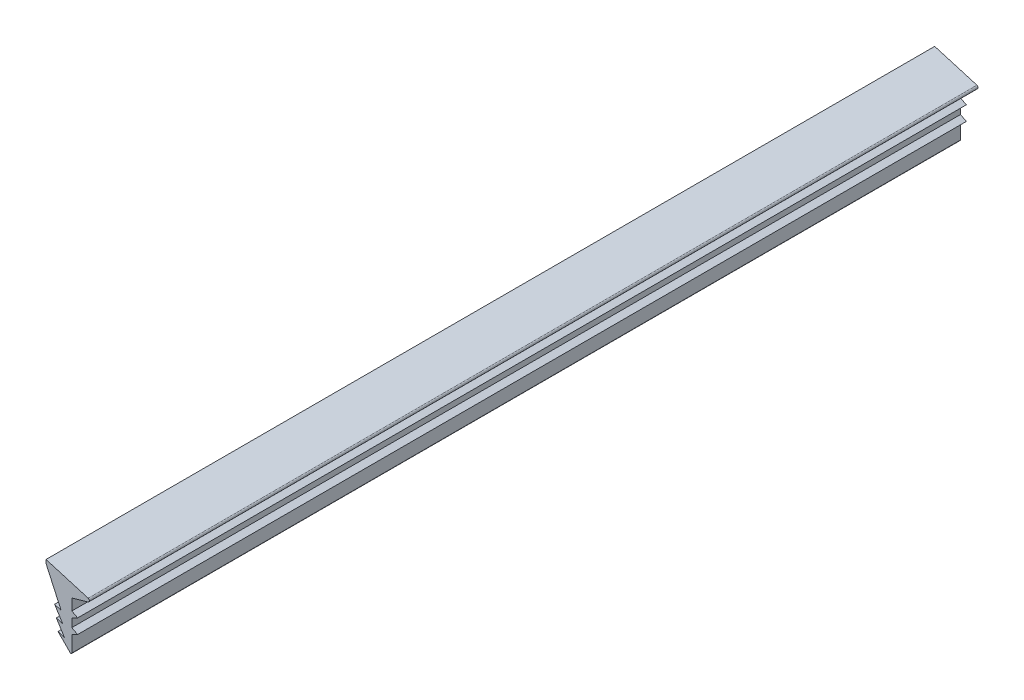
ISO-10303-21;
HEADER;
FILE_DESCRIPTION(('STEP AP214'),'2;1');
FILE_NAME('part.step','',(''),(''),'','','');
FILE_SCHEMA(('AUTOMOTIVE_DESIGN { 1 0 10303 214 1 1 1 1 }'));
ENDSEC;
DATA;
#1=APPLICATION_CONTEXT('core data for automotive mechanical design processes');
#2=APPLICATION_PROTOCOL_DEFINITION('international standard','automotive_design',2000,#1);
#3=PRODUCT_CONTEXT('',#1,'mechanical');
#4=PRODUCT('Part','Part','',(#3));
#5=PRODUCT_RELATED_PRODUCT_CATEGORY('part','',(#4));
#6=PRODUCT_DEFINITION_FORMATION('','',#4);
#7=PRODUCT_DEFINITION_CONTEXT('part definition',#1,'design');
#8=PRODUCT_DEFINITION('design','',#6,#7);
#9=PRODUCT_DEFINITION_SHAPE('','',#8);
#10=(LENGTH_UNIT() NAMED_UNIT(*) SI_UNIT(.MILLI.,.METRE.));
#11=(NAMED_UNIT(*) PLANE_ANGLE_UNIT() SI_UNIT($,.RADIAN.));
#12=(NAMED_UNIT(*) SI_UNIT($,.STERADIAN.) SOLID_ANGLE_UNIT());
#13=UNCERTAINTY_MEASURE_WITH_UNIT(LENGTH_MEASURE(1.E-05),#10,'distance_accuracy_value','');
#14=(GEOMETRIC_REPRESENTATION_CONTEXT(3) GLOBAL_UNCERTAINTY_ASSIGNED_CONTEXT((#13)) GLOBAL_UNIT_ASSIGNED_CONTEXT((#10,
#11,#12)) REPRESENTATION_CONTEXT('',''));
#15=CARTESIAN_POINT('',(0.,0.,0.));
#16=DIRECTION('',(0.,0.,1.));
#17=DIRECTION('',(1.,0.,0.));
#18=AXIS2_PLACEMENT_3D('',#15,#16,#17);
#19=CARTESIAN_POINT('',(1.83562174373094,6.17250966923791,100.));
#20=DIRECTION('',(0.,0.,-1.));
#21=DIRECTION('',(-1.,0.,0.));
#22=AXIS2_PLACEMENT_3D('',#19,#20,#21);
#23=CYLINDRICAL_SURFACE('',#22,0.199999999999988);
#24=CARTESIAN_POINT('',(1.83562174373094,6.17250966923791,0.));
#25=DIRECTION('',(0.,0.,1.));
#26=DIRECTION('',(1.,0.,0.));
#27=AXIS2_PLACEMENT_3D('',#24,#25,#26);
#28=CIRCLE('',#27,0.199999999999988);
#29=CARTESIAN_POINT('',(1.89024785978819,5.98011427572624,0.));
#30=VERTEX_POINT('',#29);
#31=CARTESIAN_POINT('',(1.91051139307632,6.35795923224873,0.));
#32=VERTEX_POINT('',#31);
#33=EDGE_CURVE('E197',#30,#32,#28,.T.);
#34=ORIENTED_EDGE('',*,*,#33,.T.);
#35=DIRECTION('',(0.,0.,-1.));
#36=VECTOR('',#35,1.);
#37=CARTESIAN_POINT('',(1.91051139307632,6.35795923224873,100.));
#38=LINE('',#37,#36);
#39=CARTESIAN_POINT('',(1.91051139307632,6.35795923224873,100.));
#40=VERTEX_POINT('',#39);
#41=EDGE_CURVE('E11',#40,#32,#38,.T.);
#42=ORIENTED_EDGE('',*,*,#41,.F.);
#43=CARTESIAN_POINT('',(1.83562174373094,6.17250966923791,100.));
#44=DIRECTION('',(0.,0.,1.));
#45=DIRECTION('',(1.,0.,0.));
#46=AXIS2_PLACEMENT_3D('',#43,#44,#45);
#47=CIRCLE('',#46,0.199999999999988);
#48=CARTESIAN_POINT('',(1.89024785978819,5.98011427572624,100.));
#49=VERTEX_POINT('',#48);
#50=EDGE_CURVE('E233',#49,#40,#47,.T.);
#51=ORIENTED_EDGE('',*,*,#50,.F.);
#52=DIRECTION('',(0.,0.,-1.));
#53=VECTOR('',#52,1.);
#54=CARTESIAN_POINT('',(1.89024785978819,5.98011427572624,100.));
#55=LINE('',#54,#53);
#56=EDGE_CURVE('E193',#49,#30,#55,.T.);
#57=ORIENTED_EDGE('',*,*,#56,.T.);
#58=EDGE_LOOP('',(#34,#42,#51,#57));
#59=FACE_BOUND('',#58,.T.);
#60=ADVANCED_FACE('F35',(#59),#23,.T.);
#61=CARTESIAN_POINT('',(1.91051139307632,6.35795923224873,100.));
#62=DIRECTION('',(-0.282629364260122,-0.959229191829523,0.));
#63=DIRECTION('',(0.959229191829523,-0.282629364260122,0.));
#64=AXIS2_PLACEMENT_3D('',#61,#62,#63);
#65=PLANE('',#64);
#66=DIRECTION('',(-0.959229191829523,0.282629364260122,0.));
#67=VECTOR('',#66,1.);
#68=CARTESIAN_POINT('',(1.91051139307632,6.35795923224873,0.));
#69=LINE('',#68,#67);
#70=CARTESIAN_POINT('',(-2.83817796549829,7.75712333808974,0.));
#71=VERTEX_POINT('',#70);
#72=EDGE_CURVE('E200',#32,#71,#69,.T.);
#73=ORIENTED_EDGE('',*,*,#72,.T.);
#74=DIRECTION('',(0.,0.,-1.));
#75=VECTOR('',#74,1.);
#76=CARTESIAN_POINT('',(-2.83817796549829,7.75712333808974,100.));
#77=LINE('',#76,#75);
#78=CARTESIAN_POINT('',(-2.83817796549829,7.75712333808974,100.));
#79=VERTEX_POINT('',#78);
#80=EDGE_CURVE('E43',#79,#71,#77,.T.);
#81=ORIENTED_EDGE('',*,*,#80,.F.);
#82=DIRECTION('',(-0.959229191829523,0.282629364260122,0.));
#83=VECTOR('',#82,1.);
#84=CARTESIAN_POINT('',(1.91051139307632,6.35795923224873,100.));
#85=LINE('',#84,#83);
#86=EDGE_CURVE('E127',#40,#79,#85,.T.);
#87=ORIENTED_EDGE('',*,*,#86,.F.);
#88=ORIENTED_EDGE('',*,*,#41,.T.);
#89=EDGE_LOOP('',(#73,#81,#87,#88));
#90=FACE_BOUND('',#89,.T.);
#91=ADVANCED_FACE('F346',(#90),#65,.F.);
#92=CARTESIAN_POINT('',(-2.83817796549829,7.37355976867627,100.));
#93=DIRECTION('',(1.,0.,0.));
#94=DIRECTION('',(0.,0.,-1.));
#95=AXIS2_PLACEMENT_3D('',#92,#93,#94);
#96=PLANE('',#95);
#97=DIRECTION('',(0.,-1.,0.));
#98=VECTOR('',#97,1.);
#99=CARTESIAN_POINT('',(-2.83817796549829,7.37355976867627,0.));
#100=LINE('',#99,#98);
#101=CARTESIAN_POINT('',(-2.83817796549829,7.37355976867627,0.));
#102=VERTEX_POINT('',#101);
#103=EDGE_CURVE('E202',#71,#102,#100,.T.);
#104=ORIENTED_EDGE('',*,*,#103,.T.);
#105=DIRECTION('',(0.,0.,-1.));
#106=VECTOR('',#105,1.);
#107=CARTESIAN_POINT('',(-2.83817796549829,7.37355976867627,100.));
#108=LINE('',#107,#106);
#109=CARTESIAN_POINT('',(-2.83817796549829,7.37355976867627,100.));
#110=VERTEX_POINT('',#109);
#111=EDGE_CURVE('E273',#110,#102,#108,.T.);
#112=ORIENTED_EDGE('',*,*,#111,.F.);
#113=DIRECTION('',(0.,-1.,0.));
#114=VECTOR('',#113,1.);
#115=CARTESIAN_POINT('',(-2.83817796549829,7.37355976867627,100.));
#116=LINE('',#115,#114);
#117=EDGE_CURVE('E281',#79,#110,#116,.T.);
#118=ORIENTED_EDGE('',*,*,#117,.F.);
#119=ORIENTED_EDGE('',*,*,#80,.T.);
#120=EDGE_LOOP('',(#104,#112,#118,#119));
#121=FACE_BOUND('',#120,.T.);
#122=ADVANCED_FACE('F279',(#121),#96,.F.);
#123=CARTESIAN_POINT('',(-1.13165430904246,3.6309799731963,100.));
#124=DIRECTION('',(0.909875769600127,0.414880806852494,0.));
#125=DIRECTION('',(-0.414880806852494,0.909875769600127,0.));
#126=AXIS2_PLACEMENT_3D('',#123,#124,#125);
#127=PLANE('',#126);
#128=DIRECTION('',(0.414880806852494,-0.909875769600127,0.));
#129=VECTOR('',#128,1.);
#130=CARTESIAN_POINT('',(-1.13165430904246,3.6309799731963,0.));
#131=LINE('',#130,#129);
#132=CARTESIAN_POINT('',(-1.13165430904246,3.6309799731963,0.));
#133=VERTEX_POINT('',#132);
#134=EDGE_CURVE('E204',#102,#133,#131,.T.);
#135=ORIENTED_EDGE('',*,*,#134,.T.);
#136=DIRECTION('',(0.,0.,-1.));
#137=VECTOR('',#136,1.);
#138=CARTESIAN_POINT('',(-1.13165430904246,3.6309799731963,100.));
#139=LINE('',#138,#137);
#140=CARTESIAN_POINT('',(-1.13165430904246,3.6309799731963,100.));
#141=VERTEX_POINT('',#140);
#142=EDGE_CURVE('E270',#141,#133,#139,.T.);
#143=ORIENTED_EDGE('',*,*,#142,.F.);
#144=DIRECTION('',(0.414880806852494,-0.909875769600127,0.));
#145=VECTOR('',#144,1.);
#146=CARTESIAN_POINT('',(-1.13165430904246,3.6309799731963,100.));
#147=LINE('',#146,#145);
#148=EDGE_CURVE('E299',#110,#141,#147,.T.);
#149=ORIENTED_EDGE('',*,*,#148,.F.);
#150=ORIENTED_EDGE('',*,*,#111,.T.);
#151=EDGE_LOOP('',(#135,#143,#149,#150));
#152=FACE_BOUND('',#151,.T.);
#153=ADVANCED_FACE('F290',(#152),#127,.F.);
#154=CARTESIAN_POINT('',(-1.86635680574454,3.88109048555646,100.));
#155=DIRECTION('',(-0.32226267098872,-0.94665028964619,0.));
#156=DIRECTION('',(0.94665028964619,-0.32226267098872,0.));
#157=AXIS2_PLACEMENT_3D('',#154,#155,#156);
#158=PLANE('',#157);
#159=DIRECTION('',(-0.94665028964619,0.32226267098872,0.));
#160=VECTOR('',#159,1.);
#161=CARTESIAN_POINT('',(-1.86635680574454,3.88109048555646,0.));
#162=LINE('',#161,#160);
#163=CARTESIAN_POINT('',(-1.86635680574454,3.88109048555646,0.));
#164=VERTEX_POINT('',#163);
#165=EDGE_CURVE('E206',#133,#164,#162,.T.);
#166=ORIENTED_EDGE('',*,*,#165,.T.);
#167=DIRECTION('',(0.,0.,-1.));
#168=VECTOR('',#167,1.);
#169=CARTESIAN_POINT('',(-1.86635680574454,3.88109048555646,100.));
#170=LINE('',#169,#168);
#171=CARTESIAN_POINT('',(-1.86635680574454,3.88109048555646,100.));
#172=VERTEX_POINT('',#171);
#173=EDGE_CURVE('E267',#172,#164,#170,.T.);
#174=ORIENTED_EDGE('',*,*,#173,.F.);
#175=DIRECTION('',(-0.94665028964619,0.32226267098872,0.));
#176=VECTOR('',#175,1.);
#177=CARTESIAN_POINT('',(-1.86635680574454,3.88109048555646,100.));
#178=LINE('',#177,#176);
#179=EDGE_CURVE('E296',#141,#172,#178,.T.);
#180=ORIENTED_EDGE('',*,*,#179,.F.);
#181=ORIENTED_EDGE('',*,*,#142,.T.);
#182=EDGE_LOOP('',(#166,#174,#180,#181));
#183=FACE_BOUND('',#182,.T.);
#184=ADVANCED_FACE('F294',(#183),#158,.F.);
#185=CARTESIAN_POINT('',(-0.940400183170823,2.39667458437282,100.));
#186=DIRECTION('',(0.848461232974316,0.529257532907849,0.));
#187=DIRECTION('',(-0.529257532907849,0.848461232974317,0.));
#188=AXIS2_PLACEMENT_3D('',#185,#186,#187);
#189=PLANE('',#188);
#190=DIRECTION('',(0.529257532907849,-0.848461232974316,0.));
#191=VECTOR('',#190,1.);
#192=CARTESIAN_POINT('',(-0.940400183170823,2.39667458437282,0.));
#193=LINE('',#192,#191);
#194=CARTESIAN_POINT('',(-0.940400183170823,2.39667458437282,0.));
#195=VERTEX_POINT('',#194);
#196=EDGE_CURVE('E208',#164,#195,#193,.T.);
#197=ORIENTED_EDGE('',*,*,#196,.T.);
#198=DIRECTION('',(0.,0.,-1.));
#199=VECTOR('',#198,1.);
#200=CARTESIAN_POINT('',(-0.940400183170823,2.39667458437282,100.));
#201=LINE('',#200,#199);
#202=CARTESIAN_POINT('',(-0.940400183170823,2.39667458437282,100.));
#203=VERTEX_POINT('',#202);
#204=EDGE_CURVE('E264',#203,#195,#201,.T.);
#205=ORIENTED_EDGE('',*,*,#204,.F.);
#206=DIRECTION('',(0.529257532907849,-0.848461232974316,0.));
#207=VECTOR('',#206,1.);
#208=CARTESIAN_POINT('',(-0.940400183170823,2.39667458437282,100.));
#209=LINE('',#208,#207);
#210=EDGE_CURVE('E298',#172,#203,#209,.T.);
#211=ORIENTED_EDGE('',*,*,#210,.F.);
#212=ORIENTED_EDGE('',*,*,#173,.T.);
#213=EDGE_LOOP('',(#197,#205,#211,#212));
#214=FACE_BOUND('',#213,.T.);
#215=ADVANCED_FACE('F359',(#214),#189,.F.);
#216=CARTESIAN_POINT('',(-1.67510267987291,2.64678509673297,100.));
#217=DIRECTION('',(-0.32226267098872,-0.94665028964619,0.));
#218=DIRECTION('',(0.94665028964619,-0.32226267098872,0.));
#219=AXIS2_PLACEMENT_3D('',#216,#217,#218);
#220=PLANE('',#219);
#221=DIRECTION('',(-0.94665028964619,0.32226267098872,0.));
#222=VECTOR('',#221,1.);
#223=CARTESIAN_POINT('',(-1.67510267987291,2.64678509673297,0.));
#224=LINE('',#223,#222);
#225=CARTESIAN_POINT('',(-1.67510267987291,2.64678509673297,0.));
#226=VERTEX_POINT('',#225);
#227=EDGE_CURVE('E210',#195,#226,#224,.T.);
#228=ORIENTED_EDGE('',*,*,#227,.T.);
#229=DIRECTION('',(0.,0.,-1.));
#230=VECTOR('',#229,1.);
#231=CARTESIAN_POINT('',(-1.67510267987291,2.64678509673297,100.));
#232=LINE('',#231,#230);
#233=CARTESIAN_POINT('',(-1.67510267987291,2.64678509673297,100.));
#234=VERTEX_POINT('',#233);
#235=EDGE_CURVE('E261',#234,#226,#232,.T.);
#236=ORIENTED_EDGE('',*,*,#235,.F.);
#237=DIRECTION('',(-0.94665028964619,0.32226267098872,0.));
#238=VECTOR('',#237,1.);
#239=CARTESIAN_POINT('',(-1.67510267987291,2.64678509673297,100.));
#240=LINE('',#239,#238);
#241=EDGE_CURVE('E301',#203,#234,#240,.T.);
#242=ORIENTED_EDGE('',*,*,#241,.F.);
#243=ORIENTED_EDGE('',*,*,#204,.T.);
#244=EDGE_LOOP('',(#228,#236,#242,#243));
#245=FACE_BOUND('',#244,.T.);
#246=ADVANCED_FACE('F362',(#245),#220,.F.);
#247=CARTESIAN_POINT('',(-0.749146057299185,1.16236919554933,100.));
#248=DIRECTION('',(0.848461232974316,0.529257532907849,0.));
#249=DIRECTION('',(-0.529257532907849,0.848461232974317,0.));
#250=AXIS2_PLACEMENT_3D('',#247,#248,#249);
#251=PLANE('',#250);
#252=DIRECTION('',(0.529257532907849,-0.848461232974316,0.));
#253=VECTOR('',#252,1.);
#254=CARTESIAN_POINT('',(-0.749146057299185,1.16236919554933,0.));
#255=LINE('',#254,#253);
#256=CARTESIAN_POINT('',(-0.749146057299185,1.16236919554933,0.));
#257=VERTEX_POINT('',#256);
#258=EDGE_CURVE('E212',#226,#257,#255,.T.);
#259=ORIENTED_EDGE('',*,*,#258,.T.);
#260=DIRECTION('',(0.,0.,-1.));
#261=VECTOR('',#260,1.);
#262=CARTESIAN_POINT('',(-0.749146057299185,1.16236919554933,100.));
#263=LINE('',#262,#261);
#264=CARTESIAN_POINT('',(-0.749146057299185,1.16236919554933,100.));
#265=VERTEX_POINT('',#264);
#266=EDGE_CURVE('E258',#265,#257,#263,.T.);
#267=ORIENTED_EDGE('',*,*,#266,.F.);
#268=DIRECTION('',(0.529257532907849,-0.848461232974316,0.));
#269=VECTOR('',#268,1.);
#270=CARTESIAN_POINT('',(-0.749146057299185,1.16236919554933,100.));
#271=LINE('',#270,#269);
#272=EDGE_CURVE('E307',#234,#265,#271,.T.);
#273=ORIENTED_EDGE('',*,*,#272,.F.);
#274=ORIENTED_EDGE('',*,*,#235,.T.);
#275=EDGE_LOOP('',(#259,#267,#273,#274));
#276=FACE_BOUND('',#275,.T.);
#277=ADVANCED_FACE('F366',(#276),#251,.F.);
#278=CARTESIAN_POINT('',(-1.48384855400127,1.41247970790948,100.));
#279=DIRECTION('',(-0.32226267098872,-0.94665028964619,0.));
#280=DIRECTION('',(0.94665028964619,-0.32226267098872,0.));
#281=AXIS2_PLACEMENT_3D('',#278,#279,#280);
#282=PLANE('',#281);
#283=DIRECTION('',(-0.94665028964619,0.32226267098872,0.));
#284=VECTOR('',#283,1.);
#285=CARTESIAN_POINT('',(-1.48384855400127,1.41247970790948,0.));
#286=LINE('',#285,#284);
#287=CARTESIAN_POINT('',(-1.48384855400127,1.41247970790948,0.));
#288=VERTEX_POINT('',#287);
#289=EDGE_CURVE('E214',#257,#288,#286,.T.);
#290=ORIENTED_EDGE('',*,*,#289,.T.);
#291=DIRECTION('',(0.,0.,-1.));
#292=VECTOR('',#291,1.);
#293=CARTESIAN_POINT('',(-1.48384855400127,1.41247970790948,100.));
#294=LINE('',#293,#292);
#295=CARTESIAN_POINT('',(-1.48384855400127,1.41247970790948,100.));
#296=VERTEX_POINT('',#295);
#297=EDGE_CURVE('E255',#296,#288,#294,.T.);
#298=ORIENTED_EDGE('',*,*,#297,.F.);
#299=DIRECTION('',(-0.94665028964619,0.32226267098872,0.));
#300=VECTOR('',#299,1.);
#301=CARTESIAN_POINT('',(-1.48384855400127,1.41247970790948,100.));
#302=LINE('',#301,#300);
#303=EDGE_CURVE('E309',#265,#296,#302,.T.);
#304=ORIENTED_EDGE('',*,*,#303,.F.);
#305=ORIENTED_EDGE('',*,*,#266,.T.);
#306=EDGE_LOOP('',(#290,#298,#304,#305));
#307=FACE_BOUND('',#306,.T.);
#308=ADVANCED_FACE('F370',(#307),#282,.F.);
#309=CARTESIAN_POINT('',(-0.109115740648349,0.022183720300518,100.));
#310=DIRECTION('',(0.711075521663788,0.703115639486544,0.));
#311=DIRECTION('',(-0.703115639486545,0.711075521663788,0.));
#312=AXIS2_PLACEMENT_3D('',#309,#310,#311);
#313=PLANE('',#312);
#314=DIRECTION('',(0.703115639486544,-0.711075521663788,0.));
#315=VECTOR('',#314,1.);
#316=CARTESIAN_POINT('',(-0.109115740648349,0.022183720300518,0.));
#317=LINE('',#316,#315);
#318=CARTESIAN_POINT('',(-0.109115740648349,0.022183720300518,0.));
#319=VERTEX_POINT('',#318);
#320=EDGE_CURVE('E216',#288,#319,#317,.T.);
#321=ORIENTED_EDGE('',*,*,#320,.T.);
#322=DIRECTION('',(0.,0.,-1.));
#323=VECTOR('',#322,1.);
#324=CARTESIAN_POINT('',(-0.109115740648349,0.022183720300518,100.));
#325=LINE('',#324,#323);
#326=CARTESIAN_POINT('',(-0.109115740648349,0.022183720300518,100.));
#327=VERTEX_POINT('',#326);
#328=EDGE_CURVE('E252',#327,#319,#325,.T.);
#329=ORIENTED_EDGE('',*,*,#328,.F.);
#330=DIRECTION('',(0.703115639486544,-0.711075521663788,0.));
#331=VECTOR('',#330,1.);
#332=CARTESIAN_POINT('',(-0.109115740648349,0.022183720300518,100.));
#333=LINE('',#332,#331);
#334=EDGE_CURVE('E311',#296,#327,#333,.T.);
#335=ORIENTED_EDGE('',*,*,#334,.F.);
#336=ORIENTED_EDGE('',*,*,#297,.T.);
#337=EDGE_LOOP('',(#321,#329,#335,#336));
#338=FACE_BOUND('',#337,.T.);
#339=ADVANCED_FACE('F374',(#338),#313,.F.);
#340=CARTESIAN_POINT('',(-0.0380081884819674,0.0924952842491393,100.));
#341=DIRECTION('',(0.,0.,-1.));
#342=DIRECTION('',(-1.,0.,0.));
#343=AXIS2_PLACEMENT_3D('',#340,#341,#342);
#344=CYLINDRICAL_SURFACE('',#343,0.100000000000001);
#345=CARTESIAN_POINT('',(-0.0380081884819674,0.0924952842491393,0.));
#346=DIRECTION('',(0.,0.,1.));
#347=DIRECTION('',(1.,0.,0.));
#348=AXIS2_PLACEMENT_3D('',#345,#346,#347);
#349=CIRCLE('',#348,0.100000000000001);
#350=CARTESIAN_POINT('',(0.0619918115180333,0.0924952842491393,0.));
#351=VERTEX_POINT('',#350);
#352=EDGE_CURVE('E218',#319,#351,#349,.T.);
#353=ORIENTED_EDGE('',*,*,#352,.T.);
#354=DIRECTION('',(0.,0.,-1.));
#355=VECTOR('',#354,1.);
#356=CARTESIAN_POINT('',(0.0619918115180333,0.0924952842491393,100.));
#357=LINE('',#356,#355);
#358=CARTESIAN_POINT('',(0.0619918115180333,0.0924952842491393,100.));
#359=VERTEX_POINT('',#358);
#360=EDGE_CURVE('E249',#359,#351,#357,.T.);
#361=ORIENTED_EDGE('',*,*,#360,.F.);
#362=CARTESIAN_POINT('',(-0.0380081884819674,0.0924952842491393,100.));
#363=DIRECTION('',(0.,0.,1.));
#364=DIRECTION('',(1.,0.,0.));
#365=AXIS2_PLACEMENT_3D('',#362,#363,#364);
#366=CIRCLE('',#365,0.100000000000001);
#367=EDGE_CURVE('E313',#327,#359,#366,.T.);
#368=ORIENTED_EDGE('',*,*,#367,.F.);
#369=ORIENTED_EDGE('',*,*,#328,.T.);
#370=EDGE_LOOP('',(#353,#361,#368,#369));
#371=FACE_BOUND('',#370,.T.);
#372=ADVANCED_FACE('F378',(#371),#344,.T.);
#373=CARTESIAN_POINT('',(0.0619918115180553,1.89317829195909,100.));
#374=DIRECTION('',(-1.,0.,0.));
#375=DIRECTION('',(0.,0.,1.));
#376=AXIS2_PLACEMENT_3D('',#373,#374,#375);
#377=PLANE('',#376);
#378=DIRECTION('',(0.,1.,0.));
#379=VECTOR('',#378,1.);
#380=CARTESIAN_POINT('',(0.0619918115180553,1.89317829195909,0.));
#381=LINE('',#380,#379);
#382=CARTESIAN_POINT('',(0.0619918115180553,1.89317829195909,0.));
#383=VERTEX_POINT('',#382);
#384=EDGE_CURVE('E220',#351,#383,#381,.T.);
#385=ORIENTED_EDGE('',*,*,#384,.T.);
#386=DIRECTION('',(0.,0.,-1.));
#387=VECTOR('',#386,1.);
#388=CARTESIAN_POINT('',(0.0619918115180553,1.89317829195909,100.));
#389=LINE('',#388,#387);
#390=CARTESIAN_POINT('',(0.0619918115180553,1.89317829195909,100.));
#391=VERTEX_POINT('',#390);
#392=EDGE_CURVE('E246',#391,#383,#389,.T.);
#393=ORIENTED_EDGE('',*,*,#392,.F.);
#394=DIRECTION('',(0.,1.,0.));
#395=VECTOR('',#394,1.);
#396=CARTESIAN_POINT('',(0.0619918115180553,1.89317829195909,100.));
#397=LINE('',#396,#395);
#398=EDGE_CURVE('E315',#359,#391,#397,.T.);
#399=ORIENTED_EDGE('',*,*,#398,.F.);
#400=ORIENTED_EDGE('',*,*,#360,.T.);
#401=EDGE_LOOP('',(#385,#393,#399,#400));
#402=FACE_BOUND('',#401,.T.);
#403=ADVANCED_FACE('F382',(#402),#377,.F.);
#404=CARTESIAN_POINT('',(0.0619918115180553,1.89317829195909,100.));
#405=DIRECTION('',(-0.449868640180448,0.893094735502452,0.));
#406=DIRECTION('',(-0.893094735502452,-0.449868640180448,0.));
#407=AXIS2_PLACEMENT_3D('',#404,#405,#406);
#408=PLANE('',#407);
#409=DIRECTION('',(0.893094735502452,0.449868640180448,0.));
#410=VECTOR('',#409,1.);
#411=CARTESIAN_POINT('',(0.0619918115180553,1.89317829195909,0.));
#412=LINE('',#411,#410);
#413=CARTESIAN_POINT('',(0.725818022890962,2.22756005814256,0.));
#414=VERTEX_POINT('',#413);
#415=EDGE_CURVE('E222',#383,#414,#412,.T.);
#416=ORIENTED_EDGE('',*,*,#415,.T.);
#417=DIRECTION('',(0.,0.,-1.));
#418=VECTOR('',#417,1.);
#419=CARTESIAN_POINT('',(0.725818022890962,2.22756005814256,100.));
#420=LINE('',#419,#418);
#421=CARTESIAN_POINT('',(0.725818022890962,2.22756005814256,100.));
#422=VERTEX_POINT('',#421);
#423=EDGE_CURVE('E243',#422,#414,#420,.T.);
#424=ORIENTED_EDGE('',*,*,#423,.F.);
#425=DIRECTION('',(0.893094735502452,0.449868640180448,0.));
#426=VECTOR('',#425,1.);
#427=CARTESIAN_POINT('',(0.0619918115180553,1.89317829195909,100.));
#428=LINE('',#427,#426);
#429=EDGE_CURVE('E317',#391,#422,#428,.T.);
#430=ORIENTED_EDGE('',*,*,#429,.F.);
#431=ORIENTED_EDGE('',*,*,#392,.T.);
#432=EDGE_LOOP('',(#416,#424,#430,#431));
#433=FACE_BOUND('',#432,.T.);
#434=ADVANCED_FACE('F386',(#433),#408,.F.);
#435=CARTESIAN_POINT('',(0.0619918115180553,2.56194182432603,100.));
#436=DIRECTION('',(-0.449868640180448,-0.893094735502452,0.));
#437=DIRECTION('',(0.893094735502452,-0.449868640180448,0.));
#438=AXIS2_PLACEMENT_3D('',#435,#436,#437);
#439=PLANE('',#438);
#440=DIRECTION('',(-0.893094735502452,0.449868640180448,0.));
#441=VECTOR('',#440,1.);
#442=CARTESIAN_POINT('',(0.0619918115180553,2.56194182432603,0.));
#443=LINE('',#442,#441);
#444=CARTESIAN_POINT('',(0.0619918115180553,2.56194182432603,0.));
#445=VERTEX_POINT('',#444);
#446=EDGE_CURVE('E224',#414,#445,#443,.T.);
#447=ORIENTED_EDGE('',*,*,#446,.T.);
#448=DIRECTION('',(0.,0.,-1.));
#449=VECTOR('',#448,1.);
#450=CARTESIAN_POINT('',(0.0619918115180553,2.56194182432603,100.));
#451=LINE('',#450,#449);
#452=CARTESIAN_POINT('',(0.0619918115180553,2.56194182432603,100.));
#453=VERTEX_POINT('',#452);
#454=EDGE_CURVE('E240',#453,#445,#451,.T.);
#455=ORIENTED_EDGE('',*,*,#454,.F.);
#456=DIRECTION('',(-0.893094735502452,0.449868640180448,0.));
#457=VECTOR('',#456,1.);
#458=CARTESIAN_POINT('',(0.0619918115180553,2.56194182432603,100.));
#459=LINE('',#458,#457);
#460=EDGE_CURVE('E319',#422,#453,#459,.T.);
#461=ORIENTED_EDGE('',*,*,#460,.F.);
#462=ORIENTED_EDGE('',*,*,#423,.T.);
#463=EDGE_LOOP('',(#447,#455,#461,#462));
#464=FACE_BOUND('',#463,.T.);
#465=ADVANCED_FACE('F390',(#464),#439,.F.);
#466=CARTESIAN_POINT('',(0.0619918115180553,2.56194182432603,100.));
#467=DIRECTION('',(-1.,0.,0.));
#468=DIRECTION('',(0.,0.,1.));
#469=AXIS2_PLACEMENT_3D('',#466,#467,#468);
#470=PLANE('',#469);
#471=DIRECTION('',(0.,1.,0.));
#472=VECTOR('',#471,1.);
#473=CARTESIAN_POINT('',(0.0619918115180553,2.56194182432603,0.));
#474=LINE('',#473,#472);
#475=CARTESIAN_POINT('',(0.0619918115180553,3.51260441788884,0.));
#476=VERTEX_POINT('',#475);
#477=EDGE_CURVE('E226',#445,#476,#474,.T.);
#478=ORIENTED_EDGE('',*,*,#477,.T.);
#479=DIRECTION('',(0.,0.,-1.));
#480=VECTOR('',#479,1.);
#481=CARTESIAN_POINT('',(0.0619918115180553,3.51260441788884,100.));
#482=LINE('',#481,#480);
#483=CARTESIAN_POINT('',(0.0619918115180553,3.51260441788884,100.));
#484=VERTEX_POINT('',#483);
#485=EDGE_CURVE('E237',#484,#476,#482,.T.);
#486=ORIENTED_EDGE('',*,*,#485,.F.);
#487=DIRECTION('',(0.,1.,0.));
#488=VECTOR('',#487,1.);
#489=CARTESIAN_POINT('',(0.0619918115180553,2.56194182432603,100.));
#490=LINE('',#489,#488);
#491=EDGE_CURVE('E321',#453,#484,#490,.T.);
#492=ORIENTED_EDGE('',*,*,#491,.F.);
#493=ORIENTED_EDGE('',*,*,#454,.T.);
#494=EDGE_LOOP('',(#478,#486,#492,#493));
#495=FACE_BOUND('',#494,.T.);
#496=ADVANCED_FACE('F327',(#495),#470,.F.);
#497=CARTESIAN_POINT('',(0.0619918115180553,3.51260441788884,100.));
#498=DIRECTION('',(-0.449868640180448,0.893094735502452,0.));
#499=DIRECTION('',(-0.893094735502452,-0.449868640180448,0.));
#500=AXIS2_PLACEMENT_3D('',#497,#498,#499);
#501=PLANE('',#500);
#502=DIRECTION('',(0.893094735502452,0.449868640180448,0.));
#503=VECTOR('',#502,1.);
#504=CARTESIAN_POINT('',(0.0619918115180553,3.51260441788884,0.));
#505=LINE('',#504,#503);
#506=CARTESIAN_POINT('',(0.725818022890962,3.84698618407231,0.));
#507=VERTEX_POINT('',#506);
#508=EDGE_CURVE('E228',#476,#507,#505,.T.);
#509=ORIENTED_EDGE('',*,*,#508,.T.);
#510=DIRECTION('',(0.,0.,-1.));
#511=VECTOR('',#510,1.);
#512=CARTESIAN_POINT('',(0.725818022890962,3.84698618407231,100.));
#513=LINE('',#512,#511);
#514=CARTESIAN_POINT('',(0.725818022890962,3.84698618407231,100.));
#515=VERTEX_POINT('',#514);
#516=EDGE_CURVE('E188',#515,#507,#513,.T.);
#517=ORIENTED_EDGE('',*,*,#516,.F.);
#518=DIRECTION('',(0.893094735502452,0.449868640180448,0.));
#519=VECTOR('',#518,1.);
#520=CARTESIAN_POINT('',(0.0619918115180553,3.51260441788884,100.));
#521=LINE('',#520,#519);
#522=EDGE_CURVE('E179',#484,#515,#521,.T.);
#523=ORIENTED_EDGE('',*,*,#522,.F.);
#524=ORIENTED_EDGE('',*,*,#485,.T.);
#525=EDGE_LOOP('',(#509,#517,#523,#524));
#526=FACE_BOUND('',#525,.T.);
#527=ADVANCED_FACE('F331',(#526),#501,.F.);
#528=CARTESIAN_POINT('',(0.0619918115180553,4.18136795025578,100.));
#529=DIRECTION('',(-0.449868640180448,-0.893094735502452,0.));
#530=DIRECTION('',(0.893094735502452,-0.449868640180448,0.));
#531=AXIS2_PLACEMENT_3D('',#528,#529,#530);
#532=PLANE('',#531);
#533=DIRECTION('',(-0.893094735502452,0.449868640180448,0.));
#534=VECTOR('',#533,1.);
#535=CARTESIAN_POINT('',(0.0619918115180553,4.18136795025578,0.));
#536=LINE('',#535,#534);
#537=CARTESIAN_POINT('',(0.0619918115180553,4.18136795025578,0.));
#538=VERTEX_POINT('',#537);
#539=EDGE_CURVE('E187',#507,#538,#536,.T.);
#540=ORIENTED_EDGE('',*,*,#539,.T.);
#541=DIRECTION('',(0.,0.,-1.));
#542=VECTOR('',#541,1.);
#543=CARTESIAN_POINT('',(0.0619918115180553,4.18136795025578,100.));
#544=LINE('',#543,#542);
#545=CARTESIAN_POINT('',(0.0619918115180553,4.18136795025578,100.));
#546=VERTEX_POINT('',#545);
#547=EDGE_CURVE('E184',#546,#538,#544,.T.);
#548=ORIENTED_EDGE('',*,*,#547,.F.);
#549=DIRECTION('',(-0.893094735502452,0.449868640180448,0.));
#550=VECTOR('',#549,1.);
#551=CARTESIAN_POINT('',(0.0619918115180553,4.18136795025578,100.));
#552=LINE('',#551,#550);
#553=EDGE_CURVE('E173',#515,#546,#552,.T.);
#554=ORIENTED_EDGE('',*,*,#553,.F.);
#555=ORIENTED_EDGE('',*,*,#516,.T.);
#556=EDGE_LOOP('',(#540,#548,#554,#555));
#557=FACE_BOUND('',#556,.T.);
#558=ADVANCED_FACE('F185',(#557),#532,.F.);
#559=CARTESIAN_POINT('',(0.0619918115180553,4.18136795025578,100.));
#560=DIRECTION('',(-1.,0.,0.));
#561=DIRECTION('',(0.,0.,1.));
#562=AXIS2_PLACEMENT_3D('',#559,#560,#561);
#563=PLANE('',#562);
#564=DIRECTION('',(0.,1.,0.));
#565=VECTOR('',#564,1.);
#566=CARTESIAN_POINT('',(0.0619918115180553,4.18136795025578,0.));
#567=LINE('',#566,#565);
#568=CARTESIAN_POINT('',(0.0619918115180553,5.46102426399386,0.));
#569=VERTEX_POINT('',#568);
#570=EDGE_CURVE('E113',#538,#569,#567,.T.);
#571=ORIENTED_EDGE('',*,*,#570,.T.);
#572=DIRECTION('',(0.,0.,-1.));
#573=VECTOR('',#572,1.);
#574=CARTESIAN_POINT('',(0.0619918115180553,5.46102426399386,100.));
#575=LINE('',#574,#573);
#576=CARTESIAN_POINT('',(0.0619918115180553,5.46102426399386,100.));
#577=VERTEX_POINT('',#576);
#578=EDGE_CURVE('E189',#577,#569,#575,.T.);
#579=ORIENTED_EDGE('',*,*,#578,.F.);
#580=DIRECTION('',(0.,1.,0.));
#581=VECTOR('',#580,1.);
#582=CARTESIAN_POINT('',(0.0619918115180553,4.18136795025578,100.));
#583=LINE('',#582,#581);
#584=EDGE_CURVE('E177',#546,#577,#583,.T.);
#585=ORIENTED_EDGE('',*,*,#584,.F.);
#586=ORIENTED_EDGE('',*,*,#547,.T.);
#587=EDGE_LOOP('',(#571,#579,#585,#586));
#588=FACE_BOUND('',#587,.T.);
#589=ADVANCED_FACE('F191',(#588),#563,.F.);
#590=CARTESIAN_POINT('',(0.0619918115180553,5.46102426399386,100.));
#591=DIRECTION('',(-0.27313058028635,0.961976967558185,0.));
#592=DIRECTION('',(-0.961976967558185,-0.27313058028635,0.));
#593=AXIS2_PLACEMENT_3D('',#590,#591,#592);
#594=PLANE('',#593);
#595=DIRECTION('',(0.961976967558185,0.27313058028635,0.));
#596=VECTOR('',#595,1.);
#597=CARTESIAN_POINT('',(0.0619918115180553,5.46102426399386,0.));
#598=LINE('',#597,#596);
#599=EDGE_CURVE('E119',#569,#30,#598,.T.);
#600=ORIENTED_EDGE('',*,*,#599,.T.);
#601=ORIENTED_EDGE('',*,*,#56,.F.);
#602=DIRECTION('',(0.961976967558185,0.27313058028635,0.));
#603=VECTOR('',#602,1.);
#604=CARTESIAN_POINT('',(0.0619918115180553,5.46102426399386,100.));
#605=LINE('',#604,#603);
#606=EDGE_CURVE('E51',#577,#49,#605,.T.);
#607=ORIENTED_EDGE('',*,*,#606,.F.);
#608=ORIENTED_EDGE('',*,*,#578,.T.);
#609=EDGE_LOOP('',(#600,#601,#607,#608));
#610=FACE_BOUND('',#609,.T.);
#611=ADVANCED_FACE('F335',(#610),#594,.F.);
#612=CARTESIAN_POINT('',(1.83562174373094,6.17250966923791,100.));
#613=DIRECTION('',(0.,0.,1.));
#614=DIRECTION('',(1.,0.,0.));
#615=AXIS2_PLACEMENT_3D('',#612,#613,#614);
#616=PLANE('',#615);
#617=ORIENTED_EDGE('',*,*,#50,.T.);
#618=ORIENTED_EDGE('',*,*,#86,.T.);
#619=ORIENTED_EDGE('',*,*,#117,.T.);
#620=ORIENTED_EDGE('',*,*,#148,.T.);
#621=ORIENTED_EDGE('',*,*,#179,.T.);
#622=ORIENTED_EDGE('',*,*,#210,.T.);
#623=ORIENTED_EDGE('',*,*,#241,.T.);
#624=ORIENTED_EDGE('',*,*,#272,.T.);
#625=ORIENTED_EDGE('',*,*,#303,.T.);
#626=ORIENTED_EDGE('',*,*,#334,.T.);
#627=ORIENTED_EDGE('',*,*,#367,.T.);
#628=ORIENTED_EDGE('',*,*,#398,.T.);
#629=ORIENTED_EDGE('',*,*,#429,.T.);
#630=ORIENTED_EDGE('',*,*,#460,.T.);
#631=ORIENTED_EDGE('',*,*,#491,.T.);
#632=ORIENTED_EDGE('',*,*,#522,.T.);
#633=ORIENTED_EDGE('',*,*,#553,.T.);
#634=ORIENTED_EDGE('',*,*,#584,.T.);
#635=ORIENTED_EDGE('',*,*,#606,.T.);
#636=EDGE_LOOP('',(#617,#618,#619,#620,#621,#622,#623,#624,#625,#626,#627,#628,#629,#630,#631,
#632,#633,#634,#635));
#637=FACE_BOUND('',#636,.T.);
#638=ADVANCED_FACE('F175',(#637),#616,.T.);
#639=CARTESIAN_POINT('',(1.83562174373094,6.17250966923791,0.));
#640=DIRECTION('',(0.,0.,1.));
#641=DIRECTION('',(1.,0.,0.));
#642=AXIS2_PLACEMENT_3D('',#639,#640,#641);
#643=PLANE('',#642);
#644=ORIENTED_EDGE('',*,*,#33,.F.);
#645=ORIENTED_EDGE('',*,*,#599,.F.);
#646=ORIENTED_EDGE('',*,*,#570,.F.);
#647=ORIENTED_EDGE('',*,*,#539,.F.);
#648=ORIENTED_EDGE('',*,*,#508,.F.);
#649=ORIENTED_EDGE('',*,*,#477,.F.);
#650=ORIENTED_EDGE('',*,*,#446,.F.);
#651=ORIENTED_EDGE('',*,*,#415,.F.);
#652=ORIENTED_EDGE('',*,*,#384,.F.);
#653=ORIENTED_EDGE('',*,*,#352,.F.);
#654=ORIENTED_EDGE('',*,*,#320,.F.);
#655=ORIENTED_EDGE('',*,*,#289,.F.);
#656=ORIENTED_EDGE('',*,*,#258,.F.);
#657=ORIENTED_EDGE('',*,*,#227,.F.);
#658=ORIENTED_EDGE('',*,*,#196,.F.);
#659=ORIENTED_EDGE('',*,*,#165,.F.);
#660=ORIENTED_EDGE('',*,*,#134,.F.);
#661=ORIENTED_EDGE('',*,*,#103,.F.);
#662=ORIENTED_EDGE('',*,*,#72,.F.);
#663=EDGE_LOOP('',(#644,#645,#646,#647,#648,#649,#650,#651,#652,#653,#654,#655,#656,#657,#658,
#659,#660,#661,#662));
#664=FACE_BOUND('',#663,.T.);
#665=ADVANCED_FACE('F285',(#664),#643,.F.);
#666=CLOSED_SHELL('',(#60,#91,#122,#153,#184,#215,#246,#277,#308,#339,#372,#403,#434,#465,#496,
#527,#558,#589,#611,#638,#665));
#667=MANIFOLD_SOLID_BREP('B2',#666);
#668=ADVANCED_BREP_SHAPE_REPRESENTATION('',(#18,#667),#14);
#669=SHAPE_DEFINITION_REPRESENTATION(#9,#668);
ENDSEC;
END-ISO-10303-21;
